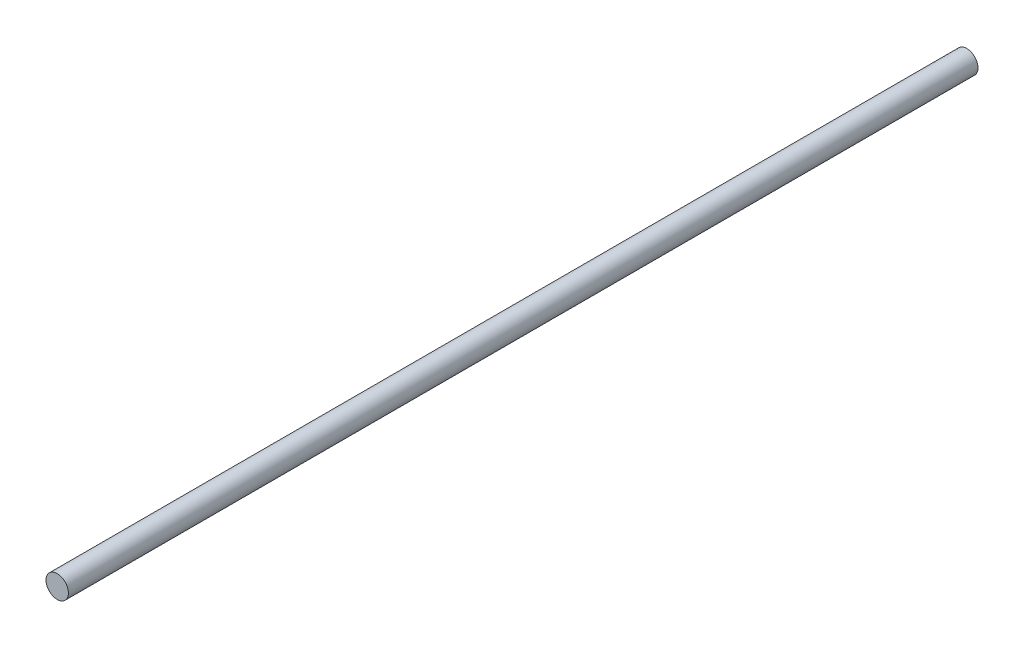
ISO-10303-21;
HEADER;
FILE_DESCRIPTION(('STEP AP214'),'2;1');
FILE_NAME('part.step','',(''),(''),'','','');
FILE_SCHEMA(('AUTOMOTIVE_DESIGN { 1 0 10303 214 1 1 1 1 }'));
ENDSEC;
DATA;
#1=APPLICATION_CONTEXT('core data for automotive mechanical design processes');
#2=APPLICATION_PROTOCOL_DEFINITION('international standard','automotive_design',2000,#1);
#3=PRODUCT_CONTEXT('',#1,'mechanical');
#4=PRODUCT('Part','Part','',(#3));
#5=PRODUCT_RELATED_PRODUCT_CATEGORY('part','',(#4));
#6=PRODUCT_DEFINITION_FORMATION('','',#4);
#7=PRODUCT_DEFINITION_CONTEXT('part definition',#1,'design');
#8=PRODUCT_DEFINITION('design','',#6,#7);
#9=PRODUCT_DEFINITION_SHAPE('','',#8);
#10=(LENGTH_UNIT() NAMED_UNIT(*) SI_UNIT(.MILLI.,.METRE.));
#11=(NAMED_UNIT(*) PLANE_ANGLE_UNIT() SI_UNIT($,.RADIAN.));
#12=(NAMED_UNIT(*) SI_UNIT($,.STERADIAN.) SOLID_ANGLE_UNIT());
#13=UNCERTAINTY_MEASURE_WITH_UNIT(LENGTH_MEASURE(1.E-05),#10,'distance_accuracy_value','');
#14=(GEOMETRIC_REPRESENTATION_CONTEXT(3) GLOBAL_UNCERTAINTY_ASSIGNED_CONTEXT((#13)) GLOBAL_UNIT_ASSIGNED_CONTEXT((#10,
#11,#12)) REPRESENTATION_CONTEXT('',''));
#15=CARTESIAN_POINT('',(0.,0.,0.));
#16=DIRECTION('',(0.,0.,1.));
#17=DIRECTION('',(1.,0.,0.));
#18=AXIS2_PLACEMENT_3D('',#15,#16,#17);
#19=CARTESIAN_POINT('',(0.,0.,1030.));
#20=DIRECTION('',(0.,0.,-1.));
#21=DIRECTION('',(-1.,0.,0.));
#22=AXIS2_PLACEMENT_3D('',#19,#20,#21);
#23=CYLINDRICAL_SURFACE('',#22,12.7);
#24=CARTESIAN_POINT('',(0.,0.,1030.));
#25=DIRECTION('',(0.,0.,1.));
#26=DIRECTION('',(1.,0.,0.));
#27=AXIS2_PLACEMENT_3D('',#24,#25,#26);
#28=CIRCLE('',#27,12.7);
#29=CARTESIAN_POINT('',(12.7,0.,1030.));
#30=VERTEX_POINT('',#29);
#31=EDGE_CURVE('E10',#30,#30,#28,.T.);
#32=ORIENTED_EDGE('',*,*,#31,.F.);
#33=EDGE_LOOP('',(#32));
#34=FACE_BOUND('',#33,.T.);
#35=CARTESIAN_POINT('',(0.,0.,0.));
#36=DIRECTION('',(0.,0.,1.));
#37=DIRECTION('',(1.,0.,0.));
#38=AXIS2_PLACEMENT_3D('',#35,#36,#37);
#39=CIRCLE('',#38,12.7);
#40=CARTESIAN_POINT('',(12.7,0.,0.));
#41=VERTEX_POINT('',#40);
#42=EDGE_CURVE('E34',#41,#41,#39,.T.);
#43=ORIENTED_EDGE('',*,*,#42,.T.);
#44=EDGE_LOOP('',(#43));
#45=FACE_BOUND('',#44,.T.);
#46=ADVANCED_FACE('F31',(#34,#45),#23,.T.);
#47=CARTESIAN_POINT('',(0.,0.,1030.));
#48=DIRECTION('',(0.,0.,1.));
#49=DIRECTION('',(1.,0.,0.));
#50=AXIS2_PLACEMENT_3D('',#47,#48,#49);
#51=PLANE('',#50);
#52=ORIENTED_EDGE('',*,*,#31,.T.);
#53=EDGE_LOOP('',(#52));
#54=FACE_BOUND('',#53,.T.);
#55=ADVANCED_FACE('F46',(#54),#51,.T.);
#56=CARTESIAN_POINT('',(0.,0.,0.));
#57=DIRECTION('',(0.,0.,1.));
#58=DIRECTION('',(1.,0.,0.));
#59=AXIS2_PLACEMENT_3D('',#56,#57,#58);
#60=PLANE('',#59);
#61=ORIENTED_EDGE('',*,*,#42,.F.);
#62=EDGE_LOOP('',(#61));
#63=FACE_BOUND('',#62,.T.);
#64=ADVANCED_FACE('F44',(#63),#60,.F.);
#65=CLOSED_SHELL('',(#46,#55,#64));
#66=MANIFOLD_SOLID_BREP('B2',#65);
#67=ADVANCED_BREP_SHAPE_REPRESENTATION('',(#18,#66),#14);
#68=SHAPE_DEFINITION_REPRESENTATION(#9,#67);
ENDSEC;
END-ISO-10303-21;
